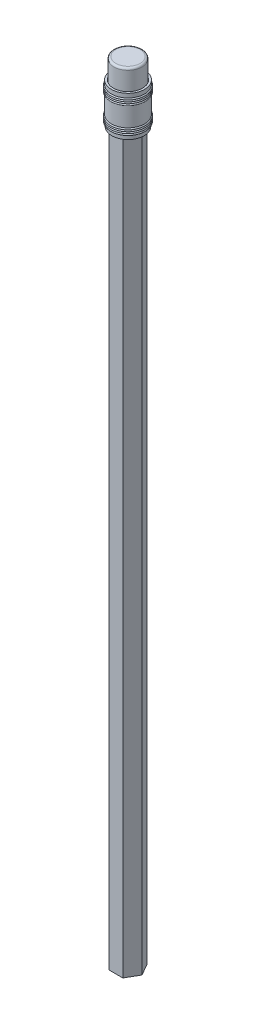
ISO-10303-21;
HEADER;
FILE_DESCRIPTION(('STEP AP214'),'2;1');
FILE_NAME('part.step','',(''),(''),'','','');
FILE_SCHEMA(('AUTOMOTIVE_DESIGN { 1 0 10303 214 1 1 1 1 }'));
ENDSEC;
DATA;
#1=APPLICATION_CONTEXT('core data for automotive mechanical design processes');
#2=APPLICATION_PROTOCOL_DEFINITION('international standard','automotive_design',2000,#1);
#3=PRODUCT_CONTEXT('',#1,'mechanical');
#4=PRODUCT('Part','Part','',(#3));
#5=PRODUCT_RELATED_PRODUCT_CATEGORY('part','',(#4));
#6=PRODUCT_DEFINITION_FORMATION('','',#4);
#7=PRODUCT_DEFINITION_CONTEXT('part definition',#1,'design');
#8=PRODUCT_DEFINITION('design','',#6,#7);
#9=PRODUCT_DEFINITION_SHAPE('','',#8);
#10=(LENGTH_UNIT() NAMED_UNIT(*) SI_UNIT(.MILLI.,.METRE.));
#11=(NAMED_UNIT(*) PLANE_ANGLE_UNIT() SI_UNIT($,.RADIAN.));
#12=(NAMED_UNIT(*) SI_UNIT($,.STERADIAN.) SOLID_ANGLE_UNIT());
#13=UNCERTAINTY_MEASURE_WITH_UNIT(LENGTH_MEASURE(1.E-05),#10,'distance_accuracy_value','');
#14=(GEOMETRIC_REPRESENTATION_CONTEXT(3) GLOBAL_UNCERTAINTY_ASSIGNED_CONTEXT((#13)) GLOBAL_UNIT_ASSIGNED_CONTEXT((#10,
#11,#12)) REPRESENTATION_CONTEXT('',''));
#15=CARTESIAN_POINT('',(0.,0.,0.));
#16=DIRECTION('',(0.,0.,1.));
#17=DIRECTION('',(1.,0.,0.));
#18=AXIS2_PLACEMENT_3D('',#15,#16,#17);
#19=CARTESIAN_POINT('',(0.,195.,0.));
#20=DIRECTION('',(0.,1.,0.));
#21=DIRECTION('',(-1.,0.,0.));
#22=AXIS2_PLACEMENT_3D('',#19,#20,#21);
#23=CYLINDRICAL_SURFACE('',#22,4.1);
#24=CARTESIAN_POINT('',(0.,188.995637156221,0.));
#25=DIRECTION('',(0.,1.,0.));
#26=DIRECTION('',(-1.,0.,0.));
#27=AXIS2_PLACEMENT_3D('',#24,#25,#26);
#28=CIRCLE('',#27,4.1);
#29=CARTESIAN_POINT('',(-4.1,188.995637156221,0.));
#30=VERTEX_POINT('',#29);
#31=EDGE_CURVE('E122',#30,#30,#28,.T.);
#32=ORIENTED_EDGE('',*,*,#31,.T.);
#33=EDGE_LOOP('',(#32));
#34=FACE_BOUND('',#33,.T.);
#35=CARTESIAN_POINT('',(0.,190.,0.));
#36=DIRECTION('',(0.,1.,0.));
#37=DIRECTION('',(-1.,0.,0.));
#38=AXIS2_PLACEMENT_3D('',#35,#36,#37);
#39=CIRCLE('',#38,4.1);
#40=CARTESIAN_POINT('',(-4.1,190.,0.));
#41=VERTEX_POINT('',#40);
#42=EDGE_CURVE('E11',#41,#41,#39,.T.);
#43=ORIENTED_EDGE('',*,*,#42,.F.);
#44=EDGE_LOOP('',(#43));
#45=FACE_BOUND('',#44,.T.);
#46=ADVANCED_FACE('F46',(#34,#45),#23,.T.);
#47=CARTESIAN_POINT('',(-4.1,190.,0.));
#48=DIRECTION('',(0.,1.,0.));
#49=DIRECTION('',(-1.,0.,0.));
#50=AXIS2_PLACEMENT_3D('',#47,#48,#49);
#51=PLANE('',#50);
#52=ORIENTED_EDGE('',*,*,#42,.T.);
#53=EDGE_LOOP('',(#52));
#54=FACE_BOUND('',#53,.T.);
#55=CARTESIAN_POINT('',(0.,190.,0.));
#56=DIRECTION('',(0.,1.,0.));
#57=DIRECTION('',(-1.,0.,0.));
#58=AXIS2_PLACEMENT_3D('',#55,#56,#57);
#59=CIRCLE('',#58,3.6);
#60=CARTESIAN_POINT('',(-3.6,190.,0.));
#61=VERTEX_POINT('',#60);
#62=EDGE_CURVE('E52',#61,#61,#59,.T.);
#63=ORIENTED_EDGE('',*,*,#62,.F.);
#64=EDGE_LOOP('',(#63));
#65=FACE_BOUND('',#64,.T.);
#66=ADVANCED_FACE('F140',(#54,#65),#51,.T.);
#67=CARTESIAN_POINT('',(0.,195.,0.));
#68=DIRECTION('',(0.,1.,0.));
#69=DIRECTION('',(-1.,0.,0.));
#70=AXIS2_PLACEMENT_3D('',#67,#68,#69);
#71=CYLINDRICAL_SURFACE('',#70,3.6);
#72=ORIENTED_EDGE('',*,*,#62,.T.);
#73=EDGE_LOOP('',(#72));
#74=FACE_BOUND('',#73,.T.);
#75=CARTESIAN_POINT('',(0.,189.000000000001,0.));
#76=DIRECTION('',(0.,1.,0.));
#77=DIRECTION('',(-1.,0.,0.));
#78=AXIS2_PLACEMENT_3D('',#75,#76,#77);
#79=CIRCLE('',#78,3.6);
#80=CARTESIAN_POINT('',(-3.6,189.000000000001,0.));
#81=VERTEX_POINT('',#80);
#82=EDGE_CURVE('E56',#81,#81,#79,.T.);
#83=ORIENTED_EDGE('',*,*,#82,.F.);
#84=EDGE_LOOP('',(#83));
#85=FACE_BOUND('',#84,.T.);
#86=ADVANCED_FACE('F144',(#74,#85),#71,.F.);
#87=CARTESIAN_POINT('',(0.,188.800000000001,0.));
#88=DIRECTION('',(0.,1.,0.));
#89=DIRECTION('',(-1.,0.,0.));
#90=AXIS2_PLACEMENT_3D('',#87,#88,#89);
#91=TOROIDAL_SURFACE('',#90,3.6,0.200000000000006);
#92=ORIENTED_EDGE('',*,*,#82,.T.);
#93=EDGE_LOOP('',(#92));
#94=FACE_BOUND('',#93,.T.);
#95=CARTESIAN_POINT('',(0.,188.600000000001,0.));
#96=DIRECTION('',(0.,1.,0.));
#97=DIRECTION('',(-1.,0.,0.));
#98=AXIS2_PLACEMENT_3D('',#95,#96,#97);
#99=CIRCLE('',#98,3.6);
#100=CARTESIAN_POINT('',(-3.6,188.600000000001,0.));
#101=VERTEX_POINT('',#100);
#102=EDGE_CURVE('E60',#101,#101,#99,.T.);
#103=ORIENTED_EDGE('',*,*,#102,.F.);
#104=EDGE_LOOP('',(#103));
#105=FACE_BOUND('',#104,.T.);
#106=ADVANCED_FACE('F148',(#94,#105),#91,.T.);
#107=CARTESIAN_POINT('',(0.,188.400000000001,0.));
#108=DIRECTION('',(0.,1.,0.));
#109=DIRECTION('',(-1.,0.,0.));
#110=AXIS2_PLACEMENT_3D('',#107,#108,#109);
#111=TOROIDAL_SURFACE('',#110,3.59999999999935,0.199999999999992);
#112=ORIENTED_EDGE('',*,*,#102,.T.);
#113=EDGE_LOOP('',(#112));
#114=FACE_BOUND('',#113,.T.);
#115=CARTESIAN_POINT('',(0.,188.200000000001,0.));
#116=DIRECTION('',(0.,1.,0.));
#117=DIRECTION('',(-1.,0.,0.));
#118=AXIS2_PLACEMENT_3D('',#115,#116,#117);
#119=CIRCLE('',#118,3.6);
#120=CARTESIAN_POINT('',(-3.6,188.200000000001,0.));
#121=VERTEX_POINT('',#120);
#122=EDGE_CURVE('E65',#121,#121,#119,.T.);
#123=ORIENTED_EDGE('',*,*,#122,.F.);
#124=EDGE_LOOP('',(#123));
#125=FACE_BOUND('',#124,.T.);
#126=ADVANCED_FACE('F154',(#114,#125),#111,.T.);
#127=CARTESIAN_POINT('',(0.,188.000000000001,0.));
#128=DIRECTION('',(0.,1.,0.));
#129=DIRECTION('',(-1.,0.,0.));
#130=AXIS2_PLACEMENT_3D('',#127,#128,#129);
#131=TOROIDAL_SURFACE('',#130,3.59999999999935,0.200000000000006);
#132=ORIENTED_EDGE('',*,*,#122,.T.);
#133=EDGE_LOOP('',(#132));
#134=FACE_BOUND('',#133,.T.);
#135=CARTESIAN_POINT('',(0.,187.800000000001,0.));
#136=DIRECTION('',(0.,1.,0.));
#137=DIRECTION('',(-1.,0.,0.));
#138=AXIS2_PLACEMENT_3D('',#135,#136,#137);
#139=CIRCLE('',#138,3.6);
#140=CARTESIAN_POINT('',(-3.6,187.800000000001,0.));
#141=VERTEX_POINT('',#140);
#142=EDGE_CURVE('E68',#141,#141,#139,.T.);
#143=ORIENTED_EDGE('',*,*,#142,.F.);
#144=EDGE_LOOP('',(#143));
#145=FACE_BOUND('',#144,.T.);
#146=ADVANCED_FACE('F158',(#134,#145),#131,.T.);
#147=CARTESIAN_POINT('',(0.,187.600000000001,0.));
#148=DIRECTION('',(0.,1.,0.));
#149=DIRECTION('',(-1.,0.,0.));
#150=AXIS2_PLACEMENT_3D('',#147,#148,#149);
#151=TOROIDAL_SURFACE('',#150,3.59999999999935,0.200000000000006);
#152=ORIENTED_EDGE('',*,*,#142,.T.);
#153=EDGE_LOOP('',(#152));
#154=FACE_BOUND('',#153,.T.);
#155=CARTESIAN_POINT('',(0.,187.400000000001,0.));
#156=DIRECTION('',(0.,1.,0.));
#157=DIRECTION('',(-1.,0.,0.));
#158=AXIS2_PLACEMENT_3D('',#155,#156,#157);
#159=CIRCLE('',#158,3.6);
#160=CARTESIAN_POINT('',(-3.6,187.400000000001,0.));
#161=VERTEX_POINT('',#160);
#162=EDGE_CURVE('E71',#161,#161,#159,.T.);
#163=ORIENTED_EDGE('',*,*,#162,.F.);
#164=EDGE_LOOP('',(#163));
#165=FACE_BOUND('',#164,.T.);
#166=ADVANCED_FACE('F162',(#154,#165),#151,.T.);
#167=CARTESIAN_POINT('',(0.,195.,0.));
#168=DIRECTION('',(0.,1.,0.));
#169=DIRECTION('',(-1.,0.,0.));
#170=AXIS2_PLACEMENT_3D('',#167,#168,#169);
#171=CYLINDRICAL_SURFACE('',#170,3.6);
#172=ORIENTED_EDGE('',*,*,#162,.T.);
#173=EDGE_LOOP('',(#172));
#174=FACE_BOUND('',#173,.T.);
#175=CARTESIAN_POINT('',(0.,182.599999999999,0.));
#176=DIRECTION('',(0.,1.,0.));
#177=DIRECTION('',(-1.,0.,0.));
#178=AXIS2_PLACEMENT_3D('',#175,#176,#177);
#179=CIRCLE('',#178,3.6);
#180=CARTESIAN_POINT('',(-3.6,182.599999999999,0.));
#181=VERTEX_POINT('',#180);
#182=EDGE_CURVE('E74',#181,#181,#179,.T.);
#183=ORIENTED_EDGE('',*,*,#182,.F.);
#184=EDGE_LOOP('',(#183));
#185=FACE_BOUND('',#184,.T.);
#186=ADVANCED_FACE('F166',(#174,#185),#171,.F.);
#187=CARTESIAN_POINT('',(0.,182.399999999999,0.));
#188=DIRECTION('',(0.,1.,0.));
#189=DIRECTION('',(-1.,0.,0.));
#190=AXIS2_PLACEMENT_3D('',#187,#188,#189);
#191=TOROIDAL_SURFACE('',#190,3.59999999999934,0.200000000000006);
#192=ORIENTED_EDGE('',*,*,#182,.T.);
#193=EDGE_LOOP('',(#192));
#194=FACE_BOUND('',#193,.T.);
#195=CARTESIAN_POINT('',(0.,182.199999999999,0.));
#196=DIRECTION('',(0.,1.,0.));
#197=DIRECTION('',(-1.,0.,0.));
#198=AXIS2_PLACEMENT_3D('',#195,#196,#197);
#199=CIRCLE('',#198,3.6);
#200=CARTESIAN_POINT('',(-3.6,182.199999999999,0.));
#201=VERTEX_POINT('',#200);
#202=EDGE_CURVE('E77',#201,#201,#199,.T.);
#203=ORIENTED_EDGE('',*,*,#202,.F.);
#204=EDGE_LOOP('',(#203));
#205=FACE_BOUND('',#204,.T.);
#206=ADVANCED_FACE('F170',(#194,#205),#191,.T.);
#207=CARTESIAN_POINT('',(0.,181.999999999999,0.));
#208=DIRECTION('',(0.,1.,0.));
#209=DIRECTION('',(-1.,0.,0.));
#210=AXIS2_PLACEMENT_3D('',#207,#208,#209);
#211=TOROIDAL_SURFACE('',#210,3.59999999999935,0.200000000000006);
#212=ORIENTED_EDGE('',*,*,#202,.T.);
#213=EDGE_LOOP('',(#212));
#214=FACE_BOUND('',#213,.T.);
#215=CARTESIAN_POINT('',(0.,181.799999999999,0.));
#216=DIRECTION('',(0.,1.,0.));
#217=DIRECTION('',(-1.,0.,0.));
#218=AXIS2_PLACEMENT_3D('',#215,#216,#217);
#219=CIRCLE('',#218,3.6);
#220=CARTESIAN_POINT('',(-3.6,181.799999999999,0.));
#221=VERTEX_POINT('',#220);
#222=EDGE_CURVE('E80',#221,#221,#219,.T.);
#223=ORIENTED_EDGE('',*,*,#222,.F.);
#224=EDGE_LOOP('',(#223));
#225=FACE_BOUND('',#224,.T.);
#226=ADVANCED_FACE('F174',(#214,#225),#211,.T.);
#227=CARTESIAN_POINT('',(0.,181.599999999999,0.));
#228=DIRECTION('',(0.,1.,0.));
#229=DIRECTION('',(-1.,0.,0.));
#230=AXIS2_PLACEMENT_3D('',#227,#228,#229);
#231=TOROIDAL_SURFACE('',#230,3.59999999999935,0.199999999999992);
#232=ORIENTED_EDGE('',*,*,#222,.T.);
#233=EDGE_LOOP('',(#232));
#234=FACE_BOUND('',#233,.T.);
#235=CARTESIAN_POINT('',(0.,181.399999999999,0.));
#236=DIRECTION('',(0.,1.,0.));
#237=DIRECTION('',(-1.,0.,0.));
#238=AXIS2_PLACEMENT_3D('',#235,#236,#237);
#239=CIRCLE('',#238,3.6);
#240=CARTESIAN_POINT('',(-3.6,181.399999999999,0.));
#241=VERTEX_POINT('',#240);
#242=EDGE_CURVE('E83',#241,#241,#239,.T.);
#243=ORIENTED_EDGE('',*,*,#242,.F.);
#244=EDGE_LOOP('',(#243));
#245=FACE_BOUND('',#244,.T.);
#246=ADVANCED_FACE('F178',(#234,#245),#231,.T.);
#247=CARTESIAN_POINT('',(0.,181.199999999999,0.));
#248=DIRECTION('',(0.,1.,0.));
#249=DIRECTION('',(-1.,0.,0.));
#250=AXIS2_PLACEMENT_3D('',#247,#248,#249);
#251=TOROIDAL_SURFACE('',#250,3.6,0.200000000000006);
#252=ORIENTED_EDGE('',*,*,#242,.T.);
#253=EDGE_LOOP('',(#252));
#254=FACE_BOUND('',#253,.T.);
#255=CARTESIAN_POINT('',(0.,180.999999999999,0.));
#256=DIRECTION('',(0.,1.,0.));
#257=DIRECTION('',(-1.,0.,0.));
#258=AXIS2_PLACEMENT_3D('',#255,#256,#257);
#259=CIRCLE('',#258,3.6);
#260=CARTESIAN_POINT('',(-3.6,180.999999999999,0.));
#261=VERTEX_POINT('',#260);
#262=EDGE_CURVE('E86',#261,#261,#259,.T.);
#263=ORIENTED_EDGE('',*,*,#262,.F.);
#264=EDGE_LOOP('',(#263));
#265=FACE_BOUND('',#264,.T.);
#266=ADVANCED_FACE('F182',(#254,#265),#251,.T.);
#267=CARTESIAN_POINT('',(0.,195.,0.));
#268=DIRECTION('',(0.,1.,0.));
#269=DIRECTION('',(-1.,0.,0.));
#270=AXIS2_PLACEMENT_3D('',#267,#268,#269);
#271=CYLINDRICAL_SURFACE('',#270,3.6);
#272=ORIENTED_EDGE('',*,*,#262,.T.);
#273=EDGE_LOOP('',(#272));
#274=FACE_BOUND('',#273,.T.);
#275=CARTESIAN_POINT('',(0.,180.00059355747,0.));
#276=DIRECTION('',(0.,1.,0.));
#277=DIRECTION('',(-1.,0.,0.));
#278=AXIS2_PLACEMENT_3D('',#275,#276,#277);
#279=CIRCLE('',#278,3.6);
#280=CARTESIAN_POINT('',(-3.6,180.00059355747,0.));
#281=VERTEX_POINT('',#280);
#282=EDGE_CURVE('E89',#281,#281,#279,.T.);
#283=ORIENTED_EDGE('',*,*,#282,.F.);
#284=EDGE_LOOP('',(#283));
#285=FACE_BOUND('',#284,.T.);
#286=ADVANCED_FACE('F186',(#274,#285),#271,.F.);
#287=CARTESIAN_POINT('',(-3.99104681240719,180.00059355747,0.));
#288=DIRECTION('',(0.,-1.,0.));
#289=DIRECTION('',(1.,0.,0.));
#290=AXIS2_PLACEMENT_3D('',#287,#288,#289);
#291=PLANE('',#290);
#292=ORIENTED_EDGE('',*,*,#282,.T.);
#293=EDGE_LOOP('',(#292));
#294=FACE_BOUND('',#293,.T.);
#295=CARTESIAN_POINT('',(0.,180.00059355747,0.));
#296=DIRECTION('',(0.,1.,0.));
#297=DIRECTION('',(-1.,0.,0.));
#298=AXIS2_PLACEMENT_3D('',#295,#296,#297);
#299=CIRCLE('',#298,3.99104681240719);
#300=CARTESIAN_POINT('',(-3.99104681240719,180.00059355747,0.));
#301=VERTEX_POINT('',#300);
#302=EDGE_CURVE('E92',#301,#301,#299,.T.);
#303=ORIENTED_EDGE('',*,*,#302,.F.);
#304=EDGE_LOOP('',(#303));
#305=FACE_BOUND('',#304,.T.);
#306=ADVANCED_FACE('F190',(#294,#305),#291,.T.);
#307=CARTESIAN_POINT('',(0.,195.,0.));
#308=DIRECTION('',(0.,1.,0.));
#309=DIRECTION('',(-1.,0.,0.));
#310=AXIS2_PLACEMENT_3D('',#307,#308,#309);
#311=CYLINDRICAL_SURFACE('',#310,3.99104681240719);
#312=ORIENTED_EDGE('',*,*,#302,.T.);
#313=EDGE_LOOP('',(#312));
#314=FACE_BOUND('',#313,.T.);
#315=CARTESIAN_POINT('',(0.,181.027919527709,0.));
#316=DIRECTION('',(0.,1.,0.));
#317=DIRECTION('',(-1.,0.,0.));
#318=AXIS2_PLACEMENT_3D('',#315,#316,#317);
#319=CIRCLE('',#318,3.99104681240719);
#320=CARTESIAN_POINT('',(-3.99104681240719,181.027919527709,0.));
#321=VERTEX_POINT('',#320);
#322=EDGE_CURVE('E95',#321,#321,#319,.T.);
#323=ORIENTED_EDGE('',*,*,#322,.F.);
#324=EDGE_LOOP('',(#323));
#325=FACE_BOUND('',#324,.T.);
#326=ADVANCED_FACE('F194',(#314,#325),#311,.T.);
#327=CARTESIAN_POINT('',(0.,181.19563715622,0.));
#328=DIRECTION('',(0.,1.,0.));
#329=DIRECTION('',(-1.,0.,0.));
#330=AXIS2_PLACEMENT_3D('',#327,#328,#329);
#331=TOROIDAL_SURFACE('',#330,4.1,0.200000000000001);
#332=ORIENTED_EDGE('',*,*,#322,.T.);
#333=EDGE_LOOP('',(#332));
#334=FACE_BOUND('',#333,.T.);
#335=CARTESIAN_POINT('',(0.,181.39563715622,0.));
#336=DIRECTION('',(0.,1.,0.));
#337=DIRECTION('',(-1.,0.,0.));
#338=AXIS2_PLACEMENT_3D('',#335,#336,#337);
#339=CIRCLE('',#338,4.1);
#340=CARTESIAN_POINT('',(-4.1,181.39563715622,0.));
#341=VERTEX_POINT('',#340);
#342=EDGE_CURVE('E98',#341,#341,#339,.T.);
#343=ORIENTED_EDGE('',*,*,#342,.F.);
#344=EDGE_LOOP('',(#343));
#345=FACE_BOUND('',#344,.T.);
#346=ADVANCED_FACE('F198',(#334,#345),#331,.T.);
#347=CARTESIAN_POINT('',(0.,181.59563715622,0.));
#348=DIRECTION('',(0.,1.,0.));
#349=DIRECTION('',(-1.,0.,0.));
#350=AXIS2_PLACEMENT_3D('',#347,#348,#349);
#351=TOROIDAL_SURFACE('',#350,4.10000000000065,0.200000000000006);
#352=ORIENTED_EDGE('',*,*,#342,.T.);
#353=EDGE_LOOP('',(#352));
#354=FACE_BOUND('',#353,.T.);
#355=CARTESIAN_POINT('',(0.,181.79563715622,0.));
#356=DIRECTION('',(0.,1.,0.));
#357=DIRECTION('',(-1.,0.,0.));
#358=AXIS2_PLACEMENT_3D('',#355,#356,#357);
#359=CIRCLE('',#358,4.1);
#360=CARTESIAN_POINT('',(-4.1,181.79563715622,0.));
#361=VERTEX_POINT('',#360);
#362=EDGE_CURVE('E101',#361,#361,#359,.T.);
#363=ORIENTED_EDGE('',*,*,#362,.F.);
#364=EDGE_LOOP('',(#363));
#365=FACE_BOUND('',#364,.T.);
#366=ADVANCED_FACE('F202',(#354,#365),#351,.T.);
#367=CARTESIAN_POINT('',(0.,181.99563715622,0.));
#368=DIRECTION('',(0.,1.,0.));
#369=DIRECTION('',(-1.,0.,0.));
#370=AXIS2_PLACEMENT_3D('',#367,#368,#369);
#371=TOROIDAL_SURFACE('',#370,4.10000000000065,0.199999999999978);
#372=ORIENTED_EDGE('',*,*,#362,.T.);
#373=EDGE_LOOP('',(#372));
#374=FACE_BOUND('',#373,.T.);
#375=CARTESIAN_POINT('',(0.,182.19563715622,0.));
#376=DIRECTION('',(0.,1.,0.));
#377=DIRECTION('',(-1.,0.,0.));
#378=AXIS2_PLACEMENT_3D('',#375,#376,#377);
#379=CIRCLE('',#378,4.1);
#380=CARTESIAN_POINT('',(-4.1,182.19563715622,0.));
#381=VERTEX_POINT('',#380);
#382=EDGE_CURVE('E104',#381,#381,#379,.T.);
#383=ORIENTED_EDGE('',*,*,#382,.F.);
#384=EDGE_LOOP('',(#383));
#385=FACE_BOUND('',#384,.T.);
#386=ADVANCED_FACE('F206',(#374,#385),#371,.T.);
#387=CARTESIAN_POINT('',(0.,182.39563715622,0.));
#388=DIRECTION('',(0.,1.,0.));
#389=DIRECTION('',(-1.,0.,0.));
#390=AXIS2_PLACEMENT_3D('',#387,#388,#389);
#391=TOROIDAL_SURFACE('',#390,4.10000000000065,0.200000000000033);
#392=ORIENTED_EDGE('',*,*,#382,.T.);
#393=EDGE_LOOP('',(#392));
#394=FACE_BOUND('',#393,.T.);
#395=CARTESIAN_POINT('',(0.,182.59563715622,0.));
#396=DIRECTION('',(0.,1.,0.));
#397=DIRECTION('',(-1.,0.,0.));
#398=AXIS2_PLACEMENT_3D('',#395,#396,#397);
#399=CIRCLE('',#398,4.1);
#400=CARTESIAN_POINT('',(-4.1,182.59563715622,0.));
#401=VERTEX_POINT('',#400);
#402=EDGE_CURVE('E107',#401,#401,#399,.T.);
#403=ORIENTED_EDGE('',*,*,#402,.F.);
#404=EDGE_LOOP('',(#403));
#405=FACE_BOUND('',#404,.T.);
#406=ADVANCED_FACE('F210',(#394,#405),#391,.T.);
#407=CARTESIAN_POINT('',(0.,195.,0.));
#408=DIRECTION('',(0.,1.,0.));
#409=DIRECTION('',(-1.,0.,0.));
#410=AXIS2_PLACEMENT_3D('',#407,#408,#409);
#411=CYLINDRICAL_SURFACE('',#410,4.1);
#412=ORIENTED_EDGE('',*,*,#402,.T.);
#413=EDGE_LOOP('',(#412));
#414=FACE_BOUND('',#413,.T.);
#415=CARTESIAN_POINT('',(0.,187.395637156221,0.));
#416=DIRECTION('',(0.,1.,0.));
#417=DIRECTION('',(-1.,0.,0.));
#418=AXIS2_PLACEMENT_3D('',#415,#416,#417);
#419=CIRCLE('',#418,4.1);
#420=CARTESIAN_POINT('',(-4.1,187.395637156221,0.));
#421=VERTEX_POINT('',#420);
#422=EDGE_CURVE('E110',#421,#421,#419,.T.);
#423=ORIENTED_EDGE('',*,*,#422,.F.);
#424=EDGE_LOOP('',(#423));
#425=FACE_BOUND('',#424,.T.);
#426=ADVANCED_FACE('F214',(#414,#425),#411,.T.);
#427=CARTESIAN_POINT('',(0.,187.595637156221,0.));
#428=DIRECTION('',(0.,1.,0.));
#429=DIRECTION('',(-1.,0.,0.));
#430=AXIS2_PLACEMENT_3D('',#427,#428,#429);
#431=TOROIDAL_SURFACE('',#430,4.10000000000065,0.200000000000006);
#432=ORIENTED_EDGE('',*,*,#422,.T.);
#433=EDGE_LOOP('',(#432));
#434=FACE_BOUND('',#433,.T.);
#435=CARTESIAN_POINT('',(0.,187.795637156221,0.));
#436=DIRECTION('',(0.,1.,0.));
#437=DIRECTION('',(-1.,0.,0.));
#438=AXIS2_PLACEMENT_3D('',#435,#436,#437);
#439=CIRCLE('',#438,4.1);
#440=CARTESIAN_POINT('',(-4.1,187.795637156221,0.));
#441=VERTEX_POINT('',#440);
#442=EDGE_CURVE('E113',#441,#441,#439,.T.);
#443=ORIENTED_EDGE('',*,*,#442,.F.);
#444=EDGE_LOOP('',(#443));
#445=FACE_BOUND('',#444,.T.);
#446=ADVANCED_FACE('F218',(#434,#445),#431,.T.);
#447=CARTESIAN_POINT('',(0.,187.995637156221,0.));
#448=DIRECTION('',(0.,1.,0.));
#449=DIRECTION('',(-1.,0.,0.));
#450=AXIS2_PLACEMENT_3D('',#447,#448,#449);
#451=TOROIDAL_SURFACE('',#450,4.10000000000065,0.200000000000006);
#452=ORIENTED_EDGE('',*,*,#442,.T.);
#453=EDGE_LOOP('',(#452));
#454=FACE_BOUND('',#453,.T.);
#455=CARTESIAN_POINT('',(0.,188.195637156221,0.));
#456=DIRECTION('',(0.,1.,0.));
#457=DIRECTION('',(-1.,0.,0.));
#458=AXIS2_PLACEMENT_3D('',#455,#456,#457);
#459=CIRCLE('',#458,4.1);
#460=CARTESIAN_POINT('',(-4.1,188.195637156221,0.));
#461=VERTEX_POINT('',#460);
#462=EDGE_CURVE('E116',#461,#461,#459,.T.);
#463=ORIENTED_EDGE('',*,*,#462,.F.);
#464=EDGE_LOOP('',(#463));
#465=FACE_BOUND('',#464,.T.);
#466=ADVANCED_FACE('F136',(#454,#465),#451,.T.);
#467=CARTESIAN_POINT('',(0.,188.395637156221,0.));
#468=DIRECTION('',(0.,1.,0.));
#469=DIRECTION('',(-1.,0.,0.));
#470=AXIS2_PLACEMENT_3D('',#467,#468,#469);
#471=TOROIDAL_SURFACE('',#470,4.10000000000065,0.199999999999978);
#472=ORIENTED_EDGE('',*,*,#462,.T.);
#473=EDGE_LOOP('',(#472));
#474=FACE_BOUND('',#473,.T.);
#475=CARTESIAN_POINT('',(0.,188.595637156221,0.));
#476=DIRECTION('',(0.,1.,0.));
#477=DIRECTION('',(-1.,0.,0.));
#478=AXIS2_PLACEMENT_3D('',#475,#476,#477);
#479=CIRCLE('',#478,4.1);
#480=CARTESIAN_POINT('',(-4.1,188.595637156221,0.));
#481=VERTEX_POINT('',#480);
#482=EDGE_CURVE('E119',#481,#481,#479,.T.);
#483=ORIENTED_EDGE('',*,*,#482,.F.);
#484=EDGE_LOOP('',(#483));
#485=FACE_BOUND('',#484,.T.);
#486=ADVANCED_FACE('F130',(#474,#485),#471,.T.);
#487=CARTESIAN_POINT('',(0.,188.795637156221,0.));
#488=DIRECTION('',(0.,1.,0.));
#489=DIRECTION('',(-1.,0.,0.));
#490=AXIS2_PLACEMENT_3D('',#487,#488,#489);
#491=TOROIDAL_SURFACE('',#490,4.1,0.200000000000033);
#492=ORIENTED_EDGE('',*,*,#482,.T.);
#493=EDGE_LOOP('',(#492));
#494=FACE_BOUND('',#493,.T.);
#495=ORIENTED_EDGE('',*,*,#31,.F.);
#496=EDGE_LOOP('',(#495));
#497=FACE_BOUND('',#496,.T.);
#498=ADVANCED_FACE('F128',(#494,#497),#491,.T.);
#499=CLOSED_SHELL('',(#46,#66,#86,#106,#126,#146,#166,#186,#206,#226,#246,#266,#286,#306,#326,
#346,#366,#386,#406,#426,#446,#466,#486,#498));
#500=MANIFOLD_SOLID_BREP('B2',#499);
#501=CARTESIAN_POINT('',(0.,195.,0.));
#502=DIRECTION('',(0.,-1.,0.));
#503=DIRECTION('',(0.,0.,-1.));
#504=AXIS2_PLACEMENT_3D('',#501,#502,#503);
#505=CYLINDRICAL_SURFACE('',#504,3.5);
#506=CARTESIAN_POINT('',(0.,194.5,0.));
#507=DIRECTION('',(0.,1.,0.));
#508=DIRECTION('',(0.,0.,1.));
#509=AXIS2_PLACEMENT_3D('',#506,#507,#508);
#510=CIRCLE('',#509,3.5);
#511=CARTESIAN_POINT('',(0.,194.5,3.5));
#512=VERTEX_POINT('',#511);
#513=EDGE_CURVE('E45',#512,#512,#510,.F.);
#514=ORIENTED_EDGE('',*,*,#513,.T.);
#515=EDGE_LOOP('',(#514));
#516=FACE_BOUND('',#515,.T.);
#517=CARTESIAN_POINT('',(0.,185.,0.));
#518=DIRECTION('',(0.,1.,0.));
#519=DIRECTION('',(0.,0.,1.));
#520=AXIS2_PLACEMENT_3D('',#517,#518,#519);
#521=CIRCLE('',#520,3.5);
#522=CARTESIAN_POINT('',(0.,185.,3.5));
#523=VERTEX_POINT('',#522);
#524=EDGE_CURVE('E432',#523,#523,#521,.T.);
#525=ORIENTED_EDGE('',*,*,#524,.T.);
#526=EDGE_LOOP('',(#525));
#527=FACE_BOUND('',#526,.T.);
#528=ADVANCED_FACE('F421',(#516,#527),#505,.T.);
#529=CARTESIAN_POINT('',(0.,195.,0.));
#530=DIRECTION('',(0.,1.,0.));
#531=DIRECTION('',(0.,0.,1.));
#532=AXIS2_PLACEMENT_3D('',#529,#530,#531);
#533=PLANE('',#532);
#534=CARTESIAN_POINT('',(0.,195.,0.));
#535=DIRECTION('',(0.,1.,0.));
#536=DIRECTION('',(0.,0.,1.));
#537=AXIS2_PLACEMENT_3D('',#534,#535,#536);
#538=CIRCLE('',#537,3.);
#539=CARTESIAN_POINT('',(0.,195.,3.));
#540=VERTEX_POINT('',#539);
#541=EDGE_CURVE('E428',#540,#540,#538,.T.);
#542=ORIENTED_EDGE('',*,*,#541,.T.);
#543=EDGE_LOOP('',(#542));
#544=FACE_BOUND('',#543,.T.);
#545=ADVANCED_FACE('F442',(#544),#533,.T.);
#546=CARTESIAN_POINT('',(0.,185.,0.));
#547=DIRECTION('',(0.,1.,0.));
#548=DIRECTION('',(0.,0.,1.));
#549=AXIS2_PLACEMENT_3D('',#546,#547,#548);
#550=PLANE('',#549);
#551=ORIENTED_EDGE('',*,*,#524,.F.);
#552=EDGE_LOOP('',(#551));
#553=FACE_BOUND('',#552,.T.);
#554=ADVANCED_FACE('F440',(#553),#550,.F.);
#555=CARTESIAN_POINT('',(0.,194.5,0.));
#556=DIRECTION('',(0.,1.,0.));
#557=DIRECTION('',(0.,0.,1.));
#558=AXIS2_PLACEMENT_3D('',#555,#556,#557);
#559=TOROIDAL_SURFACE('',#558,3.,0.5);
#560=ORIENTED_EDGE('',*,*,#513,.F.);
#561=EDGE_LOOP('',(#560));
#562=FACE_BOUND('',#561,.T.);
#563=ORIENTED_EDGE('',*,*,#541,.F.);
#564=EDGE_LOOP('',(#563));
#565=FACE_BOUND('',#564,.T.);
#566=ADVANCED_FACE('F423',(#562,#565),#559,.T.);
#567=CLOSED_SHELL('',(#528,#545,#554,#566));
#568=MANIFOLD_SOLID_BREP('B6',#567);
#569=CARTESIAN_POINT('',(-1.73205080756888,194.165151389912,3.));
#570=DIRECTION('',(-0.866025403784439,0.,0.5));
#571=DIRECTION('',(0.5,0.,0.866025403784439));
#572=AXIS2_PLACEMENT_3D('',#569,#570,#571);
#573=PLANE('',#572);
#574=DIRECTION('',(0.,-1.,0.));
#575=VECTOR('',#574,1.);
#576=CARTESIAN_POINT('',(-1.73205080756888,194.165151389912,3.));
#577=LINE('',#576,#575);
#578=CARTESIAN_POINT('',(-1.73205080756888,185.,3.));
#579=VERTEX_POINT('',#578);
#580=CARTESIAN_POINT('',(-1.73205080756888,0.,3.));
#581=VERTEX_POINT('',#580);
#582=EDGE_CURVE('E549',#579,#581,#577,.T.);
#583=ORIENTED_EDGE('',*,*,#582,.F.);
#584=DIRECTION('',(-0.5,0.,-0.866025403784439));
#585=VECTOR('',#584,1.);
#586=CARTESIAN_POINT('',(-1.73205080756888,185.,3.));
#587=LINE('',#586,#585);
#588=CARTESIAN_POINT('',(-3.46410161513776,185.,0.));
#589=VERTEX_POINT('',#588);
#590=EDGE_CURVE('E588',#579,#589,#587,.T.);
#591=ORIENTED_EDGE('',*,*,#590,.T.);
#592=DIRECTION('',(0.,-1.,0.));
#593=VECTOR('',#592,1.);
#594=CARTESIAN_POINT('',(-3.46410161513776,194.165151389912,0.));
#595=LINE('',#594,#593);
#596=CARTESIAN_POINT('',(-3.46410161513776,0.,0.));
#597=VERTEX_POINT('',#596);
#598=EDGE_CURVE('E488',#589,#597,#595,.T.);
#599=ORIENTED_EDGE('',*,*,#598,.T.);
#600=DIRECTION('',(-0.5,0.,-0.866025403784438));
#601=VECTOR('',#600,1.);
#602=CARTESIAN_POINT('',(-1.73205080756888,0.,3.));
#603=LINE('',#602,#601);
#604=EDGE_CURVE('E583',#581,#597,#603,.T.);
#605=ORIENTED_EDGE('',*,*,#604,.F.);
#606=EDGE_LOOP('',(#583,#591,#599,#605));
#607=FACE_BOUND('',#606,.T.);
#608=ADVANCED_FACE('F484',(#607),#573,.T.);
#609=CARTESIAN_POINT('',(1.73205080756888,194.165151389912,3.));
#610=DIRECTION('',(0.,0.,1.));
#611=DIRECTION('',(1.,0.,0.));
#612=AXIS2_PLACEMENT_3D('',#609,#610,#611);
#613=PLANE('',#612);
#614=DIRECTION('',(0.,-1.,0.));
#615=VECTOR('',#614,1.);
#616=CARTESIAN_POINT('',(1.73205080756888,194.165151389912,3.));
#617=LINE('',#616,#615);
#618=CARTESIAN_POINT('',(1.73205080756888,185.,3.));
#619=VERTEX_POINT('',#618);
#620=CARTESIAN_POINT('',(1.73205080756888,0.,3.));
#621=VERTEX_POINT('',#620);
#622=EDGE_CURVE('E548',#619,#621,#617,.T.);
#623=ORIENTED_EDGE('',*,*,#622,.F.);
#624=DIRECTION('',(-1.,0.,0.));
#625=VECTOR('',#624,1.);
#626=CARTESIAN_POINT('',(1.73205080756888,185.,3.));
#627=LINE('',#626,#625);
#628=EDGE_CURVE('E544',#619,#579,#627,.T.);
#629=ORIENTED_EDGE('',*,*,#628,.T.);
#630=ORIENTED_EDGE('',*,*,#582,.T.);
#631=DIRECTION('',(-1.,0.,0.));
#632=VECTOR('',#631,1.);
#633=CARTESIAN_POINT('',(1.73205080756888,0.,3.));
#634=LINE('',#633,#632);
#635=EDGE_CURVE('E494',#621,#581,#634,.T.);
#636=ORIENTED_EDGE('',*,*,#635,.F.);
#637=EDGE_LOOP('',(#623,#629,#630,#636));
#638=FACE_BOUND('',#637,.T.);
#639=ADVANCED_FACE('F619',(#638),#613,.T.);
#640=CARTESIAN_POINT('',(3.46410161513775,194.165151389912,0.));
#641=DIRECTION('',(0.866025403784439,0.,0.5));
#642=DIRECTION('',(0.5,0.,-0.866025403784439));
#643=AXIS2_PLACEMENT_3D('',#640,#641,#642);
#644=PLANE('',#643);
#645=DIRECTION('',(0.,-1.,0.));
#646=VECTOR('',#645,1.);
#647=CARTESIAN_POINT('',(3.46410161513775,194.165151389912,0.));
#648=LINE('',#647,#646);
#649=CARTESIAN_POINT('',(3.46410161513775,185.,0.));
#650=VERTEX_POINT('',#649);
#651=CARTESIAN_POINT('',(3.46410161513775,0.,0.));
#652=VERTEX_POINT('',#651);
#653=EDGE_CURVE('E552',#650,#652,#648,.T.);
#654=ORIENTED_EDGE('',*,*,#653,.F.);
#655=DIRECTION('',(-0.5,0.,0.866025403784439));
#656=VECTOR('',#655,1.);
#657=CARTESIAN_POINT('',(3.46410161513775,185.,0.));
#658=LINE('',#657,#656);
#659=EDGE_CURVE('E537',#650,#619,#658,.T.);
#660=ORIENTED_EDGE('',*,*,#659,.T.);
#661=ORIENTED_EDGE('',*,*,#622,.T.);
#662=DIRECTION('',(-0.5,0.,0.866025403784439));
#663=VECTOR('',#662,1.);
#664=CARTESIAN_POINT('',(3.46410161513775,0.,0.));
#665=LINE('',#664,#663);
#666=EDGE_CURVE('E555',#652,#621,#665,.T.);
#667=ORIENTED_EDGE('',*,*,#666,.F.);
#668=EDGE_LOOP('',(#654,#660,#661,#667));
#669=FACE_BOUND('',#668,.T.);
#670=ADVANCED_FACE('F553',(#669),#644,.T.);
#671=CARTESIAN_POINT('',(1.73205080756888,194.165151389912,-3.));
#672=DIRECTION('',(0.866025403784439,0.,-0.5));
#673=DIRECTION('',(-0.5,0.,-0.866025403784439));
#674=AXIS2_PLACEMENT_3D('',#671,#672,#673);
#675=PLANE('',#674);
#676=DIRECTION('',(0.,-1.,0.));
#677=VECTOR('',#676,1.);
#678=CARTESIAN_POINT('',(1.73205080756888,194.165151389912,-3.));
#679=LINE('',#678,#677);
#680=CARTESIAN_POINT('',(1.73205080756888,185.,-3.));
#681=VERTEX_POINT('',#680);
#682=CARTESIAN_POINT('',(1.73205080756888,0.,-3.));
#683=VERTEX_POINT('',#682);
#684=EDGE_CURVE('E562',#681,#683,#679,.T.);
#685=ORIENTED_EDGE('',*,*,#684,.F.);
#686=DIRECTION('',(0.5,0.,0.866025403784439));
#687=VECTOR('',#686,1.);
#688=CARTESIAN_POINT('',(1.73205080756888,185.,-3.));
#689=LINE('',#688,#687);
#690=EDGE_CURVE('E541',#681,#650,#689,.T.);
#691=ORIENTED_EDGE('',*,*,#690,.T.);
#692=ORIENTED_EDGE('',*,*,#653,.T.);
#693=DIRECTION('',(0.5,0.,0.866025403784439));
#694=VECTOR('',#693,1.);
#695=CARTESIAN_POINT('',(1.73205080756888,0.,-3.));
#696=LINE('',#695,#694);
#697=EDGE_CURVE('E613',#683,#652,#696,.T.);
#698=ORIENTED_EDGE('',*,*,#697,.F.);
#699=EDGE_LOOP('',(#685,#691,#692,#698));
#700=FACE_BOUND('',#699,.T.);
#701=ADVANCED_FACE('F561',(#700),#675,.T.);
#702=CARTESIAN_POINT('',(-1.73205080756888,194.165151389912,-3.));
#703=DIRECTION('',(0.,0.,-1.));
#704=DIRECTION('',(-1.,0.,0.));
#705=AXIS2_PLACEMENT_3D('',#702,#703,#704);
#706=PLANE('',#705);
#707=DIRECTION('',(0.,-1.,0.));
#708=VECTOR('',#707,1.);
#709=CARTESIAN_POINT('',(-1.73205080756888,194.165151389912,-3.));
#710=LINE('',#709,#708);
#711=CARTESIAN_POINT('',(-1.73205080756888,185.,-3.));
#712=VERTEX_POINT('',#711);
#713=CARTESIAN_POINT('',(-1.73205080756888,0.,-3.));
#714=VERTEX_POINT('',#713);
#715=EDGE_CURVE('E574',#712,#714,#710,.T.);
#716=ORIENTED_EDGE('',*,*,#715,.F.);
#717=DIRECTION('',(1.,0.,0.));
#718=VECTOR('',#717,1.);
#719=CARTESIAN_POINT('',(-1.73205080756888,185.,-3.));
#720=LINE('',#719,#718);
#721=EDGE_CURVE('E508',#712,#681,#720,.T.);
#722=ORIENTED_EDGE('',*,*,#721,.T.);
#723=ORIENTED_EDGE('',*,*,#684,.T.);
#724=DIRECTION('',(1.,0.,0.));
#725=VECTOR('',#724,1.);
#726=CARTESIAN_POINT('',(-1.73205080756888,0.,-3.));
#727=LINE('',#726,#725);
#728=EDGE_CURVE('E604',#714,#683,#727,.T.);
#729=ORIENTED_EDGE('',*,*,#728,.F.);
#730=EDGE_LOOP('',(#716,#722,#723,#729));
#731=FACE_BOUND('',#730,.T.);
#732=ADVANCED_FACE('F638',(#731),#706,.T.);
#733=CARTESIAN_POINT('',(-3.46410161513776,194.165151389912,0.));
#734=DIRECTION('',(-0.866025403784439,0.,-0.5));
#735=DIRECTION('',(-0.5,0.,0.866025403784439));
#736=AXIS2_PLACEMENT_3D('',#733,#734,#735);
#737=PLANE('',#736);
#738=ORIENTED_EDGE('',*,*,#598,.F.);
#739=DIRECTION('',(0.5,0.,-0.866025403784439));
#740=VECTOR('',#739,1.);
#741=CARTESIAN_POINT('',(-3.46410161513776,185.,0.));
#742=LINE('',#741,#740);
#743=EDGE_CURVE('E502',#589,#712,#742,.T.);
#744=ORIENTED_EDGE('',*,*,#743,.T.);
#745=ORIENTED_EDGE('',*,*,#715,.T.);
#746=DIRECTION('',(0.5,0.,-0.866025403784439));
#747=VECTOR('',#746,1.);
#748=CARTESIAN_POINT('',(-3.46410161513776,0.,0.));
#749=LINE('',#748,#747);
#750=EDGE_CURVE('E599',#597,#714,#749,.T.);
#751=ORIENTED_EDGE('',*,*,#750,.F.);
#752=EDGE_LOOP('',(#738,#744,#745,#751));
#753=FACE_BOUND('',#752,.T.);
#754=ADVANCED_FACE('F600',(#753),#737,.T.);
#755=CARTESIAN_POINT('',(0.,194.165151389912,0.));
#756=DIRECTION('',(0.,-1.,0.));
#757=DIRECTION('',(0.,0.,-1.));
#758=AXIS2_PLACEMENT_3D('',#755,#756,#757);
#759=CYLINDRICAL_SURFACE('',#758,1.25);
#760=CARTESIAN_POINT('',(0.,0.,0.));
#761=DIRECTION('',(0.,-1.,0.));
#762=DIRECTION('',(0.,0.,-1.));
#763=AXIS2_PLACEMENT_3D('',#760,#761,#762);
#764=CIRCLE('',#763,1.25);
#765=CARTESIAN_POINT('',(0.,0.,-1.25));
#766=VERTEX_POINT('',#765);
#767=EDGE_CURVE('E576',#766,#766,#764,.T.);
#768=ORIENTED_EDGE('',*,*,#767,.T.);
#769=EDGE_LOOP('',(#768));
#770=FACE_BOUND('',#769,.T.);
#771=CARTESIAN_POINT('',(0.,185.,0.));
#772=DIRECTION('',(0.,1.,0.));
#773=DIRECTION('',(0.,0.,1.));
#774=AXIS2_PLACEMENT_3D('',#771,#772,#773);
#775=CIRCLE('',#774,1.25);
#776=CARTESIAN_POINT('',(0.,185.,1.25));
#777=VERTEX_POINT('',#776);
#778=EDGE_CURVE('E419',#777,#777,#775,.F.);
#779=ORIENTED_EDGE('',*,*,#778,.F.);
#780=EDGE_LOOP('',(#779));
#781=FACE_BOUND('',#780,.T.);
#782=ADVANCED_FACE('F629',(#770,#781),#759,.F.);
#783=CARTESIAN_POINT('',(0.,0.,0.));
#784=DIRECTION('',(0.,-1.,0.));
#785=DIRECTION('',(0.,0.,-1.));
#786=AXIS2_PLACEMENT_3D('',#783,#784,#785);
#787=PLANE('',#786);
#788=ORIENTED_EDGE('',*,*,#767,.F.);
#789=EDGE_LOOP('',(#788));
#790=FACE_BOUND('',#789,.T.);
#791=ORIENTED_EDGE('',*,*,#604,.T.);
#792=ORIENTED_EDGE('',*,*,#750,.T.);
#793=ORIENTED_EDGE('',*,*,#728,.T.);
#794=ORIENTED_EDGE('',*,*,#697,.T.);
#795=ORIENTED_EDGE('',*,*,#666,.T.);
#796=ORIENTED_EDGE('',*,*,#635,.T.);
#797=EDGE_LOOP('',(#791,#792,#793,#794,#795,#796));
#798=FACE_BOUND('',#797,.T.);
#799=ADVANCED_FACE('F606',(#790,#798),#787,.T.);
#800=CARTESIAN_POINT('',(0.,185.,0.));
#801=DIRECTION('',(0.,1.,0.));
#802=DIRECTION('',(0.,0.,1.));
#803=AXIS2_PLACEMENT_3D('',#800,#801,#802);
#804=PLANE('',#803);
#805=ORIENTED_EDGE('',*,*,#590,.F.);
#806=ORIENTED_EDGE('',*,*,#628,.F.);
#807=ORIENTED_EDGE('',*,*,#659,.F.);
#808=ORIENTED_EDGE('',*,*,#690,.F.);
#809=ORIENTED_EDGE('',*,*,#721,.F.);
#810=ORIENTED_EDGE('',*,*,#743,.F.);
#811=EDGE_LOOP('',(#805,#806,#807,#808,#809,#810));
#812=FACE_BOUND('',#811,.T.);
#813=ORIENTED_EDGE('',*,*,#778,.T.);
#814=EDGE_LOOP('',(#813));
#815=FACE_BOUND('',#814,.T.);
#816=ADVANCED_FACE('F486',(#812,#815),#804,.T.);
#817=CLOSED_SHELL('',(#608,#639,#670,#701,#732,#754,#782,#799,#816));
#818=MANIFOLD_SOLID_BREP('B40',#817);
#819=CARTESIAN_POINT('',(0.,185.,0.));
#820=DIRECTION('',(0.,-1.,0.));
#821=DIRECTION('',(0.,0.,-1.));
#822=AXIS2_PLACEMENT_3D('',#819,#820,#821);
#823=CYLINDRICAL_SURFACE('',#822,1.25);
#824=CARTESIAN_POINT('',(0.,185.,0.));
#825=DIRECTION('',(0.,1.,0.));
#826=DIRECTION('',(0.,0.,1.));
#827=AXIS2_PLACEMENT_3D('',#824,#825,#826);
#828=CIRCLE('',#827,1.25);
#829=CARTESIAN_POINT('',(0.,185.,1.25));
#830=VERTEX_POINT('',#829);
#831=EDGE_CURVE('E483',#830,#830,#828,.T.);
#832=ORIENTED_EDGE('',*,*,#831,.F.);
#833=EDGE_LOOP('',(#832));
#834=FACE_BOUND('',#833,.T.);
#835=CARTESIAN_POINT('',(0.,0.,0.));
#836=DIRECTION('',(0.,1.,0.));
#837=DIRECTION('',(0.,0.,1.));
#838=AXIS2_PLACEMENT_3D('',#835,#836,#837);
#839=CIRCLE('',#838,1.25);
#840=CARTESIAN_POINT('',(0.,0.,1.25));
#841=VERTEX_POINT('',#840);
#842=EDGE_CURVE('E704',#841,#841,#839,.T.);
#843=ORIENTED_EDGE('',*,*,#842,.T.);
#844=EDGE_LOOP('',(#843));
#845=FACE_BOUND('',#844,.T.);
#846=ADVANCED_FACE('F701',(#834,#845),#823,.T.);
#847=CARTESIAN_POINT('',(0.,185.,0.));
#848=DIRECTION('',(0.,1.,0.));
#849=DIRECTION('',(0.,0.,1.));
#850=AXIS2_PLACEMENT_3D('',#847,#848,#849);
#851=PLANE('',#850);
#852=ORIENTED_EDGE('',*,*,#831,.T.);
#853=EDGE_LOOP('',(#852));
#854=FACE_BOUND('',#853,.T.);
#855=ADVANCED_FACE('F716',(#854),#851,.T.);
#856=CARTESIAN_POINT('',(0.,0.,0.));
#857=DIRECTION('',(0.,1.,0.));
#858=DIRECTION('',(0.,0.,1.));
#859=AXIS2_PLACEMENT_3D('',#856,#857,#858);
#860=PLANE('',#859);
#861=ORIENTED_EDGE('',*,*,#842,.F.);
#862=EDGE_LOOP('',(#861));
#863=FACE_BOUND('',#862,.T.);
#864=ADVANCED_FACE('F714',(#863),#860,.F.);
#865=CLOSED_SHELL('',(#846,#855,#864));
#866=MANIFOLD_SOLID_BREP('B413',#865);
#867=ADVANCED_BREP_SHAPE_REPRESENTATION('',(#18,#500,#568,#818,#866),#14);
#868=SHAPE_DEFINITION_REPRESENTATION(#9,#867);
ENDSEC;
END-ISO-10303-21;
